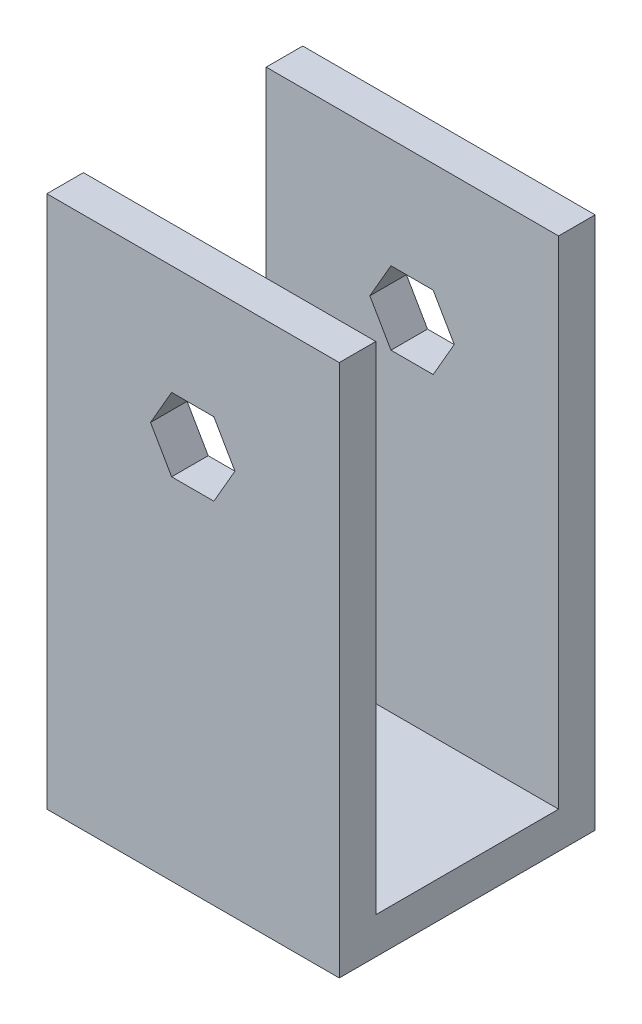
ISO-10303-21;
HEADER;
FILE_DESCRIPTION(('STEP AP214'),'2;1');
FILE_NAME('part.step','',(''),(''),'','','');
FILE_SCHEMA(('AUTOMOTIVE_DESIGN { 1 0 10303 214 1 1 1 1 }'));
ENDSEC;
DATA;
#1=APPLICATION_CONTEXT('core data for automotive mechanical design processes');
#2=APPLICATION_PROTOCOL_DEFINITION('international standard','automotive_design',2000,#1);
#3=PRODUCT_CONTEXT('',#1,'mechanical');
#4=PRODUCT('Part','Part','',(#3));
#5=PRODUCT_RELATED_PRODUCT_CATEGORY('part','',(#4));
#6=PRODUCT_DEFINITION_FORMATION('','',#4);
#7=PRODUCT_DEFINITION_CONTEXT('part definition',#1,'design');
#8=PRODUCT_DEFINITION('design','',#6,#7);
#9=PRODUCT_DEFINITION_SHAPE('','',#8);
#10=(LENGTH_UNIT() NAMED_UNIT(*) SI_UNIT(.MILLI.,.METRE.));
#11=(NAMED_UNIT(*) PLANE_ANGLE_UNIT() SI_UNIT($,.RADIAN.));
#12=(NAMED_UNIT(*) SI_UNIT($,.STERADIAN.) SOLID_ANGLE_UNIT());
#13=UNCERTAINTY_MEASURE_WITH_UNIT(LENGTH_MEASURE(1.E-05),#10,'distance_accuracy_value','');
#14=(GEOMETRIC_REPRESENTATION_CONTEXT(3) GLOBAL_UNCERTAINTY_ASSIGNED_CONTEXT((#13)) GLOBAL_UNIT_ASSIGNED_CONTEXT((#10,
#11,#12)) REPRESENTATION_CONTEXT('',''));
#15=CARTESIAN_POINT('',(0.,0.,0.));
#16=DIRECTION('',(0.,0.,1.));
#17=DIRECTION('',(1.,0.,0.));
#18=AXIS2_PLACEMENT_3D('',#15,#16,#17);
#19=CARTESIAN_POINT('',(-990.720655188937,0.,6.35));
#20=DIRECTION('',(1.,0.,0.));
#21=DIRECTION('',(0.,0.,-1.));
#22=AXIS2_PLACEMENT_3D('',#19,#20,#21);
#23=PLANE('',#22);
#24=DIRECTION('',(0.,-1.,0.));
#25=VECTOR('',#24,1.);
#26=CARTESIAN_POINT('',(-990.720655188937,0.,0.));
#27=LINE('',#26,#25);
#28=CARTESIAN_POINT('',(-990.720655188937,634.949730060437,0.));
#29=VERTEX_POINT('',#28);
#30=CARTESIAN_POINT('',(-990.720655188937,542.357532007237,0.));
#31=VERTEX_POINT('',#30);
#32=EDGE_CURVE('E160',#29,#31,#27,.T.);
#33=ORIENTED_EDGE('',*,*,#32,.T.);
#34=DIRECTION('',(0.,0.,-1.));
#35=VECTOR('',#34,1.);
#36=CARTESIAN_POINT('',(-990.720655188937,542.357532007237,38.1));
#37=LINE('',#36,#35);
#38=CARTESIAN_POINT('',(-990.720655188937,542.357532007237,44.45));
#39=VERTEX_POINT('',#38);
#40=EDGE_CURVE('E374',#39,#31,#37,.T.);
#41=ORIENTED_EDGE('',*,*,#40,.F.);
#42=DIRECTION('',(0.,-1.,0.));
#43=VECTOR('',#42,1.);
#44=CARTESIAN_POINT('',(-990.720655188937,0.,44.45));
#45=LINE('',#44,#43);
#46=CARTESIAN_POINT('',(-990.720655188937,634.949730060437,44.45));
#47=VERTEX_POINT('',#46);
#48=EDGE_CURVE('E294',#47,#39,#45,.T.);
#49=ORIENTED_EDGE('',*,*,#48,.F.);
#50=DIRECTION('',(0.,0.,-1.));
#51=VECTOR('',#50,1.);
#52=CARTESIAN_POINT('',(-990.720655188937,634.949730060437,44.45));
#53=LINE('',#52,#51);
#54=CARTESIAN_POINT('',(-990.720655188937,634.949730060437,38.1));
#55=VERTEX_POINT('',#54);
#56=EDGE_CURVE('E346',#47,#55,#53,.T.);
#57=ORIENTED_EDGE('',*,*,#56,.T.);
#58=DIRECTION('',(0.,-1.,0.));
#59=VECTOR('',#58,1.);
#60=CARTESIAN_POINT('',(-990.720655188937,0.,38.1));
#61=LINE('',#60,#59);
#62=CARTESIAN_POINT('',(-990.720655188937,548.707532007236,38.1));
#63=VERTEX_POINT('',#62);
#64=EDGE_CURVE('E338',#55,#63,#61,.T.);
#65=ORIENTED_EDGE('',*,*,#64,.T.);
#66=DIRECTION('',(0.,0.,-1.));
#67=VECTOR('',#66,1.);
#68=CARTESIAN_POINT('',(-990.720655188937,548.707532007236,38.1));
#69=LINE('',#68,#67);
#70=CARTESIAN_POINT('',(-990.720655188937,548.707532007236,6.35000000000002));
#71=VERTEX_POINT('',#70);
#72=EDGE_CURVE('E145',#63,#71,#69,.T.);
#73=ORIENTED_EDGE('',*,*,#72,.T.);
#74=DIRECTION('',(0.,-1.,0.));
#75=VECTOR('',#74,1.);
#76=CARTESIAN_POINT('',(-990.720655188937,0.,6.35));
#77=LINE('',#76,#75);
#78=CARTESIAN_POINT('',(-990.720655188937,634.949730060437,6.35));
#79=VERTEX_POINT('',#78);
#80=EDGE_CURVE('E132',#79,#71,#77,.T.);
#81=ORIENTED_EDGE('',*,*,#80,.F.);
#82=DIRECTION('',(0.,0.,-1.));
#83=VECTOR('',#82,1.);
#84=CARTESIAN_POINT('',(-990.720655188937,634.949730060437,6.35));
#85=LINE('',#84,#83);
#86=EDGE_CURVE('E45',#79,#29,#85,.T.);
#87=ORIENTED_EDGE('',*,*,#86,.T.);
#88=EDGE_LOOP('',(#33,#41,#49,#57,#65,#73,#81,#87));
#89=FACE_BOUND('',#88,.T.);
#90=ADVANCED_FACE('F35',(#89),#23,.F.);
#91=CARTESIAN_POINT('',(-939.920655188937,0.,6.35));
#92=DIRECTION('',(1.,0.,0.));
#93=DIRECTION('',(0.,0.,-1.));
#94=AXIS2_PLACEMENT_3D('',#91,#92,#93);
#95=PLANE('',#94);
#96=DIRECTION('',(0.,-1.,0.));
#97=VECTOR('',#96,1.);
#98=CARTESIAN_POINT('',(-939.920655188937,0.,0.));
#99=LINE('',#98,#97);
#100=CARTESIAN_POINT('',(-939.920655188937,634.949730060437,0.));
#101=VERTEX_POINT('',#100);
#102=CARTESIAN_POINT('',(-939.920655188937,542.357532007237,0.));
#103=VERTEX_POINT('',#102);
#104=EDGE_CURVE('E162',#101,#103,#99,.T.);
#105=ORIENTED_EDGE('',*,*,#104,.F.);
#106=DIRECTION('',(0.,0.,-1.));
#107=VECTOR('',#106,1.);
#108=CARTESIAN_POINT('',(-939.920655188937,634.949730060437,6.35));
#109=LINE('',#108,#107);
#110=CARTESIAN_POINT('',(-939.920655188937,634.949730060437,6.35));
#111=VERTEX_POINT('',#110);
#112=EDGE_CURVE('E11',#111,#101,#109,.T.);
#113=ORIENTED_EDGE('',*,*,#112,.F.);
#114=DIRECTION('',(0.,-1.,0.));
#115=VECTOR('',#114,1.);
#116=CARTESIAN_POINT('',(-939.920655188937,0.,6.35));
#117=LINE('',#116,#115);
#118=CARTESIAN_POINT('',(-939.920655188937,548.707532007236,6.35));
#119=VERTEX_POINT('',#118);
#120=EDGE_CURVE('E131',#111,#119,#117,.T.);
#121=ORIENTED_EDGE('',*,*,#120,.T.);
#122=DIRECTION('',(0.,0.,-1.));
#123=VECTOR('',#122,1.);
#124=CARTESIAN_POINT('',(-939.920655188937,548.707532007236,38.1));
#125=LINE('',#124,#123);
#126=CARTESIAN_POINT('',(-939.920655188937,548.707532007236,38.1));
#127=VERTEX_POINT('',#126);
#128=EDGE_CURVE('E112',#127,#119,#125,.T.);
#129=ORIENTED_EDGE('',*,*,#128,.F.);
#130=DIRECTION('',(0.,1.,0.));
#131=VECTOR('',#130,1.);
#132=CARTESIAN_POINT('',(-939.920655188937,0.,38.1));
#133=LINE('',#132,#131);
#134=CARTESIAN_POINT('',(-939.920655188937,634.949730060437,38.1));
#135=VERTEX_POINT('',#134);
#136=EDGE_CURVE('E341',#127,#135,#133,.T.);
#137=ORIENTED_EDGE('',*,*,#136,.T.);
#138=DIRECTION('',(0.,0.,-1.));
#139=VECTOR('',#138,1.);
#140=CARTESIAN_POINT('',(-939.920655188937,634.949730060437,44.45));
#141=LINE('',#140,#139);
#142=CARTESIAN_POINT('',(-939.920655188937,634.949730060437,44.45));
#143=VERTEX_POINT('',#142);
#144=EDGE_CURVE('E348',#143,#135,#141,.T.);
#145=ORIENTED_EDGE('',*,*,#144,.F.);
#146=DIRECTION('',(0.,1.,0.));
#147=VECTOR('',#146,1.);
#148=CARTESIAN_POINT('',(-939.920655188937,0.,44.45));
#149=LINE('',#148,#147);
#150=CARTESIAN_POINT('',(-939.920655188937,542.357532007237,44.45));
#151=VERTEX_POINT('',#150);
#152=EDGE_CURVE('E310',#151,#143,#149,.T.);
#153=ORIENTED_EDGE('',*,*,#152,.F.);
#154=DIRECTION('',(0.,0.,-1.));
#155=VECTOR('',#154,1.);
#156=CARTESIAN_POINT('',(-939.920655188937,542.357532007237,38.1));
#157=LINE('',#156,#155);
#158=EDGE_CURVE('E124',#151,#103,#157,.T.);
#159=ORIENTED_EDGE('',*,*,#158,.T.);
#160=EDGE_LOOP('',(#105,#113,#121,#129,#137,#145,#153,#159));
#161=FACE_BOUND('',#160,.T.);
#162=ADVANCED_FACE('F134',(#161),#95,.T.);
#163=CARTESIAN_POINT('',(-993.473423088237,573.582148252724,6.35));
#164=DIRECTION('',(0.866025403784442,-0.499999999999994,0.));
#165=DIRECTION('',(0.499999999999994,0.866025403784442,0.));
#166=AXIS2_PLACEMENT_3D('',#163,#164,#165);
#167=PLANE('',#166);
#168=DIRECTION('',(-0.499999999999994,-0.866025403784442,0.));
#169=VECTOR('',#168,1.);
#170=CARTESIAN_POINT('',(-993.473423088237,573.582148252724,0.));
#171=LINE('',#170,#169);
#172=CARTESIAN_POINT('',(-969.0413558401,615.899730060437,0.));
#173=VERTEX_POINT('',#172);
#174=CARTESIAN_POINT('',(-972.707530049454,609.549730060437,0.));
#175=VERTEX_POINT('',#174);
#176=EDGE_CURVE('E141',#173,#175,#171,.T.);
#177=ORIENTED_EDGE('',*,*,#176,.F.);
#178=DIRECTION('',(0.,0.,-1.));
#179=VECTOR('',#178,1.);
#180=CARTESIAN_POINT('',(-969.0413558401,615.899730060437,6.35));
#181=LINE('',#180,#179);
#182=CARTESIAN_POINT('',(-969.0413558401,615.899730060437,6.35));
#183=VERTEX_POINT('',#182);
#184=EDGE_CURVE('E39',#183,#173,#181,.T.);
#185=ORIENTED_EDGE('',*,*,#184,.F.);
#186=DIRECTION('',(-0.499999999999994,-0.866025403784442,0.));
#187=VECTOR('',#186,1.);
#188=CARTESIAN_POINT('',(-993.473423088237,573.582148252724,6.35));
#189=LINE('',#188,#187);
#190=CARTESIAN_POINT('',(-972.707530049454,609.549730060437,6.35));
#191=VERTEX_POINT('',#190);
#192=EDGE_CURVE('E168',#183,#191,#189,.T.);
#193=ORIENTED_EDGE('',*,*,#192,.T.);
#194=DIRECTION('',(0.,0.,-1.));
#195=VECTOR('',#194,1.);
#196=CARTESIAN_POINT('',(-972.707530049454,609.549730060437,6.35));
#197=LINE('',#196,#195);
#198=EDGE_CURVE('E137',#191,#175,#197,.T.);
#199=ORIENTED_EDGE('',*,*,#198,.T.);
#200=EDGE_LOOP('',(#177,#185,#193,#199));
#201=FACE_BOUND('',#200,.T.);
#202=ADVANCED_FACE('F37',(#201),#167,.T.);
#203=CARTESIAN_POINT('',(0.,615.899730060437,6.35));
#204=DIRECTION('',(0.,-1.,0.));
#205=DIRECTION('',(0.,0.,-1.));
#206=AXIS2_PLACEMENT_3D('',#203,#204,#205);
#207=PLANE('',#206);
#208=DIRECTION('',(-1.,0.,0.));
#209=VECTOR('',#208,1.);
#210=CARTESIAN_POINT('',(0.,615.899730060437,0.));
#211=LINE('',#210,#209);
#212=CARTESIAN_POINT('',(-961.709007421391,615.899730060437,0.));
#213=VERTEX_POINT('',#212);
#214=EDGE_CURVE('E144',#213,#173,#211,.T.);
#215=ORIENTED_EDGE('',*,*,#214,.F.);
#216=DIRECTION('',(0.,0.,-1.));
#217=VECTOR('',#216,1.);
#218=CARTESIAN_POINT('',(-961.709007421391,615.899730060437,6.35));
#219=LINE('',#218,#217);
#220=CARTESIAN_POINT('',(-961.709007421391,615.899730060437,6.35));
#221=VERTEX_POINT('',#220);
#222=EDGE_CURVE('E176',#221,#213,#219,.T.);
#223=ORIENTED_EDGE('',*,*,#222,.F.);
#224=DIRECTION('',(-1.,0.,0.));
#225=VECTOR('',#224,1.);
#226=CARTESIAN_POINT('',(0.,615.899730060437,6.35));
#227=LINE('',#226,#225);
#228=EDGE_CURVE('E185',#221,#183,#227,.T.);
#229=ORIENTED_EDGE('',*,*,#228,.T.);
#230=ORIENTED_EDGE('',*,*,#184,.T.);
#231=EDGE_LOOP('',(#215,#223,#229,#230));
#232=FACE_BOUND('',#231,.T.);
#233=ADVANCED_FACE('F183',(#232),#207,.T.);
#234=CARTESIAN_POINT('',(-454.58934935789,-262.457283222512,6.35));
#235=DIRECTION('',(-0.866025403784441,-0.499999999999996,0.));
#236=DIRECTION('',(0.499999999999996,-0.866025403784441,0.));
#237=AXIS2_PLACEMENT_3D('',#234,#235,#236);
#238=PLANE('',#237);
#239=DIRECTION('',(-0.499999999999996,0.866025403784441,0.));
#240=VECTOR('',#239,1.);
#241=CARTESIAN_POINT('',(-454.58934935789,-262.457283222512,0.));
#242=LINE('',#241,#240);
#243=CARTESIAN_POINT('',(-958.042833212037,609.549730060437,0.));
#244=VERTEX_POINT('',#243);
#245=EDGE_CURVE('E148',#244,#213,#242,.T.);
#246=ORIENTED_EDGE('',*,*,#245,.F.);
#247=DIRECTION('',(0.,0.,-1.));
#248=VECTOR('',#247,1.);
#249=CARTESIAN_POINT('',(-958.042833212037,609.549730060437,6.35));
#250=LINE('',#249,#248);
#251=CARTESIAN_POINT('',(-958.042833212037,609.549730060437,6.35));
#252=VERTEX_POINT('',#251);
#253=EDGE_CURVE('E175',#252,#244,#250,.T.);
#254=ORIENTED_EDGE('',*,*,#253,.F.);
#255=DIRECTION('',(-0.499999999999996,0.866025403784441,0.));
#256=VECTOR('',#255,1.);
#257=CARTESIAN_POINT('',(-454.58934935789,-262.457283222512,6.35));
#258=LINE('',#257,#256);
#259=EDGE_CURVE('E193',#252,#221,#258,.T.);
#260=ORIENTED_EDGE('',*,*,#259,.T.);
#261=ORIENTED_EDGE('',*,*,#222,.T.);
#262=EDGE_LOOP('',(#246,#254,#260,#261));
#263=FACE_BOUND('',#262,.T.);
#264=ADVANCED_FACE('F191',(#263),#238,.T.);
#265=CARTESIAN_POINT('',(-982.474900460172,567.232148252729,6.35));
#266=DIRECTION('',(-0.866025403784439,0.499999999999999,0.));
#267=DIRECTION('',(-0.499999999999999,-0.866025403784439,0.));
#268=AXIS2_PLACEMENT_3D('',#265,#266,#267);
#269=PLANE('',#268);
#270=DIRECTION('',(0.499999999999999,0.866025403784439,0.));
#271=VECTOR('',#270,1.);
#272=CARTESIAN_POINT('',(-982.474900460172,567.232148252729,0.));
#273=LINE('',#272,#271);
#274=CARTESIAN_POINT('',(-961.709007421391,603.199730060437,0.));
#275=VERTEX_POINT('',#274);
#276=EDGE_CURVE('E151',#275,#244,#273,.T.);
#277=ORIENTED_EDGE('',*,*,#276,.F.);
#278=DIRECTION('',(0.,0.,-1.));
#279=VECTOR('',#278,1.);
#280=CARTESIAN_POINT('',(-961.709007421391,603.199730060437,6.35));
#281=LINE('',#280,#279);
#282=CARTESIAN_POINT('',(-961.709007421391,603.199730060437,6.35));
#283=VERTEX_POINT('',#282);
#284=EDGE_CURVE('E173',#283,#275,#281,.T.);
#285=ORIENTED_EDGE('',*,*,#284,.F.);
#286=DIRECTION('',(0.499999999999999,0.866025403784439,0.));
#287=VECTOR('',#286,1.);
#288=CARTESIAN_POINT('',(-982.474900460172,567.232148252729,6.35));
#289=LINE('',#288,#287);
#290=EDGE_CURVE('E199',#283,#252,#289,.T.);
#291=ORIENTED_EDGE('',*,*,#290,.T.);
#292=ORIENTED_EDGE('',*,*,#253,.T.);
#293=EDGE_LOOP('',(#277,#285,#291,#292));
#294=FACE_BOUND('',#293,.T.);
#295=ADVANCED_FACE('F202',(#294),#269,.T.);
#296=CARTESIAN_POINT('',(0.,603.199730060437,6.35));
#297=DIRECTION('',(0.,1.,0.));
#298=DIRECTION('',(0.,0.,1.));
#299=AXIS2_PLACEMENT_3D('',#296,#297,#298);
#300=PLANE('',#299);
#301=DIRECTION('',(1.,0.,0.));
#302=VECTOR('',#301,1.);
#303=CARTESIAN_POINT('',(0.,603.199730060437,0.));
#304=LINE('',#303,#302);
#305=CARTESIAN_POINT('',(-969.0413558401,603.199730060437,0.));
#306=VERTEX_POINT('',#305);
#307=EDGE_CURVE('E154',#306,#275,#304,.T.);
#308=ORIENTED_EDGE('',*,*,#307,.F.);
#309=DIRECTION('',(0.,0.,-1.));
#310=VECTOR('',#309,1.);
#311=CARTESIAN_POINT('',(-969.0413558401,603.199730060437,6.35));
#312=LINE('',#311,#310);
#313=CARTESIAN_POINT('',(-969.0413558401,603.199730060437,6.35));
#314=VERTEX_POINT('',#313);
#315=EDGE_CURVE('E171',#314,#306,#312,.T.);
#316=ORIENTED_EDGE('',*,*,#315,.F.);
#317=DIRECTION('',(1.,0.,0.));
#318=VECTOR('',#317,1.);
#319=CARTESIAN_POINT('',(0.,603.199730060437,6.35));
#320=LINE('',#319,#318);
#321=EDGE_CURVE('E203',#314,#283,#320,.T.);
#322=ORIENTED_EDGE('',*,*,#321,.T.);
#323=ORIENTED_EDGE('',*,*,#284,.T.);
#324=EDGE_LOOP('',(#308,#316,#322,#323));
#325=FACE_BOUND('',#324,.T.);
#326=ADVANCED_FACE('F215',(#325),#300,.T.);
#327=CARTESIAN_POINT('',(-465.587871985946,-268.807283222512,6.35));
#328=DIRECTION('',(0.866025403784438,0.500000000000001,0.));
#329=DIRECTION('',(-0.500000000000001,0.866025403784438,0.));
#330=AXIS2_PLACEMENT_3D('',#327,#328,#329);
#331=PLANE('',#330);
#332=DIRECTION('',(0.500000000000001,-0.866025403784438,0.));
#333=VECTOR('',#332,1.);
#334=CARTESIAN_POINT('',(-465.587871985946,-268.807283222512,0.));
#335=LINE('',#334,#333);
#336=EDGE_CURVE('E157',#175,#306,#335,.T.);
#337=ORIENTED_EDGE('',*,*,#336,.F.);
#338=ORIENTED_EDGE('',*,*,#198,.F.);
#339=DIRECTION('',(0.500000000000001,-0.866025403784438,0.));
#340=VECTOR('',#339,1.);
#341=CARTESIAN_POINT('',(-465.587871985946,-268.807283222512,6.35));
#342=LINE('',#341,#340);
#343=EDGE_CURVE('E205',#191,#314,#342,.T.);
#344=ORIENTED_EDGE('',*,*,#343,.T.);
#345=ORIENTED_EDGE('',*,*,#315,.T.);
#346=EDGE_LOOP('',(#337,#338,#344,#345));
#347=FACE_BOUND('',#346,.T.);
#348=ADVANCED_FACE('F212',(#347),#331,.T.);
#349=CARTESIAN_POINT('',(0.,634.949730060437,6.35));
#350=DIRECTION('',(0.,1.,0.));
#351=DIRECTION('',(0.,0.,1.));
#352=AXIS2_PLACEMENT_3D('',#349,#350,#351);
#353=PLANE('',#352);
#354=DIRECTION('',(1.,0.,0.));
#355=VECTOR('',#354,1.);
#356=CARTESIAN_POINT('',(0.,634.949730060437,0.));
#357=LINE('',#356,#355);
#358=EDGE_CURVE('E165',#29,#101,#357,.T.);
#359=ORIENTED_EDGE('',*,*,#358,.F.);
#360=ORIENTED_EDGE('',*,*,#86,.F.);
#361=DIRECTION('',(1.,0.,0.));
#362=VECTOR('',#361,1.);
#363=CARTESIAN_POINT('',(0.,634.949730060437,6.35));
#364=LINE('',#363,#362);
#365=EDGE_CURVE('E135',#79,#111,#364,.T.);
#366=ORIENTED_EDGE('',*,*,#365,.T.);
#367=ORIENTED_EDGE('',*,*,#112,.T.);
#368=EDGE_LOOP('',(#359,#360,#366,#367));
#369=FACE_BOUND('',#368,.T.);
#370=ADVANCED_FACE('F222',(#369),#353,.T.);
#371=CARTESIAN_POINT('',(0.,0.,6.35));
#372=DIRECTION('',(0.,0.,1.));
#373=DIRECTION('',(1.,0.,0.));
#374=AXIS2_PLACEMENT_3D('',#371,#372,#373);
#375=PLANE('',#374);
#376=ORIENTED_EDGE('',*,*,#192,.F.);
#377=ORIENTED_EDGE('',*,*,#228,.F.);
#378=ORIENTED_EDGE('',*,*,#259,.F.);
#379=ORIENTED_EDGE('',*,*,#290,.F.);
#380=ORIENTED_EDGE('',*,*,#321,.F.);
#381=ORIENTED_EDGE('',*,*,#343,.F.);
#382=EDGE_LOOP('',(#376,#377,#378,#379,#380,#381));
#383=FACE_BOUND('',#382,.T.);
#384=ORIENTED_EDGE('',*,*,#80,.T.);
#385=DIRECTION('',(1.,0.,0.));
#386=VECTOR('',#385,1.);
#387=CARTESIAN_POINT('',(0.,548.707532007236,6.35));
#388=LINE('',#387,#386);
#389=EDGE_CURVE('E116',#71,#119,#388,.T.);
#390=ORIENTED_EDGE('',*,*,#389,.T.);
#391=ORIENTED_EDGE('',*,*,#120,.F.);
#392=ORIENTED_EDGE('',*,*,#365,.F.);
#393=EDGE_LOOP('',(#384,#390,#391,#392));
#394=FACE_BOUND('',#393,.T.);
#395=ADVANCED_FACE('F129',(#383,#394),#375,.T.);
#396=CARTESIAN_POINT('',(0.,0.,0.));
#397=DIRECTION('',(0.,0.,1.));
#398=DIRECTION('',(1.,0.,0.));
#399=AXIS2_PLACEMENT_3D('',#396,#397,#398);
#400=PLANE('',#399);
#401=ORIENTED_EDGE('',*,*,#176,.T.);
#402=ORIENTED_EDGE('',*,*,#336,.T.);
#403=ORIENTED_EDGE('',*,*,#307,.T.);
#404=ORIENTED_EDGE('',*,*,#276,.T.);
#405=ORIENTED_EDGE('',*,*,#245,.T.);
#406=ORIENTED_EDGE('',*,*,#214,.T.);
#407=EDGE_LOOP('',(#401,#402,#403,#404,#405,#406));
#408=FACE_BOUND('',#407,.T.);
#409=ORIENTED_EDGE('',*,*,#32,.F.);
#410=ORIENTED_EDGE('',*,*,#358,.T.);
#411=ORIENTED_EDGE('',*,*,#104,.T.);
#412=DIRECTION('',(1.,0.,0.));
#413=VECTOR('',#412,1.);
#414=CARTESIAN_POINT('',(0.,542.357532007237,0.));
#415=LINE('',#414,#413);
#416=EDGE_CURVE('E352',#31,#103,#415,.T.);
#417=ORIENTED_EDGE('',*,*,#416,.F.);
#418=EDGE_LOOP('',(#409,#410,#411,#417));
#419=FACE_BOUND('',#418,.T.);
#420=ADVANCED_FACE('F188',(#408,#419),#400,.F.);
#421=CARTESIAN_POINT('',(0.,548.707532007236,38.1));
#422=DIRECTION('',(0.,1.,0.));
#423=DIRECTION('',(0.,0.,1.));
#424=AXIS2_PLACEMENT_3D('',#421,#422,#423);
#425=PLANE('',#424);
#426=ORIENTED_EDGE('',*,*,#389,.F.);
#427=ORIENTED_EDGE('',*,*,#72,.F.);
#428=DIRECTION('',(1.,0.,0.));
#429=VECTOR('',#428,1.);
#430=CARTESIAN_POINT('',(0.,548.707532007236,38.1));
#431=LINE('',#430,#429);
#432=EDGE_CURVE('E120',#63,#127,#431,.T.);
#433=ORIENTED_EDGE('',*,*,#432,.T.);
#434=ORIENTED_EDGE('',*,*,#128,.T.);
#435=EDGE_LOOP('',(#426,#427,#433,#434));
#436=FACE_BOUND('',#435,.T.);
#437=ADVANCED_FACE('F114',(#436),#425,.T.);
#438=CARTESIAN_POINT('',(0.,542.357532007237,38.1));
#439=DIRECTION('',(0.,1.,0.));
#440=DIRECTION('',(0.,0.,1.));
#441=AXIS2_PLACEMENT_3D('',#438,#439,#440);
#442=PLANE('',#441);
#443=ORIENTED_EDGE('',*,*,#416,.T.);
#444=ORIENTED_EDGE('',*,*,#158,.F.);
#445=DIRECTION('',(1.,0.,0.));
#446=VECTOR('',#445,1.);
#447=CARTESIAN_POINT('',(0.,542.357532007237,44.45));
#448=LINE('',#447,#446);
#449=EDGE_CURVE('E298',#39,#151,#448,.T.);
#450=ORIENTED_EDGE('',*,*,#449,.F.);
#451=ORIENTED_EDGE('',*,*,#40,.T.);
#452=EDGE_LOOP('',(#443,#444,#450,#451));
#453=FACE_BOUND('',#452,.T.);
#454=ADVANCED_FACE('F240',(#453),#442,.F.);
#455=CARTESIAN_POINT('',(-454.589349357911,-262.457283222513,44.45));
#456=DIRECTION('',(-0.86602540378445,-0.49999999999998,0.));
#457=DIRECTION('',(0.49999999999998,-0.86602540378445,0.));
#458=AXIS2_PLACEMENT_3D('',#455,#456,#457);
#459=PLANE('',#458);
#460=DIRECTION('',(-0.49999999999998,0.86602540378445,0.));
#461=VECTOR('',#460,1.);
#462=CARTESIAN_POINT('',(-454.589349357911,-262.457283222513,38.1));
#463=LINE('',#462,#461);
#464=CARTESIAN_POINT('',(-958.042833212037,609.549730060437,38.1));
#465=VERTEX_POINT('',#464);
#466=CARTESIAN_POINT('',(-961.709007421391,615.899730060437,38.1));
#467=VERTEX_POINT('',#466);
#468=EDGE_CURVE('E320',#465,#467,#463,.T.);
#469=ORIENTED_EDGE('',*,*,#468,.F.);
#470=DIRECTION('',(0.,0.,-1.));
#471=VECTOR('',#470,1.);
#472=CARTESIAN_POINT('',(-958.042833212037,609.549730060437,44.45));
#473=LINE('',#472,#471);
#474=CARTESIAN_POINT('',(-958.042833212037,609.549730060437,44.45));
#475=VERTEX_POINT('',#474);
#476=EDGE_CURVE('E349',#475,#465,#473,.T.);
#477=ORIENTED_EDGE('',*,*,#476,.F.);
#478=DIRECTION('',(-0.49999999999998,0.86602540378445,0.));
#479=VECTOR('',#478,1.);
#480=CARTESIAN_POINT('',(-454.589349357911,-262.457283222513,44.45));
#481=LINE('',#480,#479);
#482=CARTESIAN_POINT('',(-961.709007421391,615.899730060437,44.45));
#483=VERTEX_POINT('',#482);
#484=EDGE_CURVE('E287',#475,#483,#481,.T.);
#485=ORIENTED_EDGE('',*,*,#484,.T.);
#486=DIRECTION('',(0.,0.,-1.));
#487=VECTOR('',#486,1.);
#488=CARTESIAN_POINT('',(-961.709007421391,615.899730060437,44.45));
#489=LINE('',#488,#487);
#490=EDGE_CURVE('E319',#483,#467,#489,.T.);
#491=ORIENTED_EDGE('',*,*,#490,.T.);
#492=EDGE_LOOP('',(#469,#477,#485,#491));
#493=FACE_BOUND('',#492,.T.);
#494=ADVANCED_FACE('F243',(#493),#459,.T.);
#495=CARTESIAN_POINT('',(-982.474900460178,567.232148252716,44.45));
#496=DIRECTION('',(-0.866025403784446,0.499999999999988,0.));
#497=DIRECTION('',(-0.499999999999988,-0.866025403784446,0.));
#498=AXIS2_PLACEMENT_3D('',#495,#496,#497);
#499=PLANE('',#498);
#500=DIRECTION('',(0.499999999999988,0.866025403784446,0.));
#501=VECTOR('',#500,1.);
#502=CARTESIAN_POINT('',(-982.474900460178,567.232148252716,38.1));
#503=LINE('',#502,#501);
#504=CARTESIAN_POINT('',(-961.709007421391,603.199730060437,38.1));
#505=VERTEX_POINT('',#504);
#506=EDGE_CURVE('E323',#505,#465,#503,.T.);
#507=ORIENTED_EDGE('',*,*,#506,.F.);
#508=DIRECTION('',(0.,0.,-1.));
#509=VECTOR('',#508,1.);
#510=CARTESIAN_POINT('',(-961.709007421391,603.199730060437,44.45));
#511=LINE('',#510,#509);
#512=CARTESIAN_POINT('',(-961.709007421391,603.199730060437,44.45));
#513=VERTEX_POINT('',#512);
#514=EDGE_CURVE('E364',#513,#505,#511,.T.);
#515=ORIENTED_EDGE('',*,*,#514,.F.);
#516=DIRECTION('',(0.499999999999988,0.866025403784446,0.));
#517=VECTOR('',#516,1.);
#518=CARTESIAN_POINT('',(-982.474900460178,567.232148252716,44.45));
#519=LINE('',#518,#517);
#520=EDGE_CURVE('E428',#513,#475,#519,.T.);
#521=ORIENTED_EDGE('',*,*,#520,.T.);
#522=ORIENTED_EDGE('',*,*,#476,.T.);
#523=EDGE_LOOP('',(#507,#515,#521,#522));
#524=FACE_BOUND('',#523,.T.);
#525=ADVANCED_FACE('F247',(#524),#499,.T.);
#526=CARTESIAN_POINT('',(0.,603.199730060437,44.45));
#527=DIRECTION('',(0.,1.,0.));
#528=DIRECTION('',(0.,0.,1.));
#529=AXIS2_PLACEMENT_3D('',#526,#527,#528);
#530=PLANE('',#529);
#531=DIRECTION('',(1.,0.,0.));
#532=VECTOR('',#531,1.);
#533=CARTESIAN_POINT('',(0.,603.199730060437,38.1));
#534=LINE('',#533,#532);
#535=CARTESIAN_POINT('',(-969.0413558401,603.199730060437,38.1));
#536=VERTEX_POINT('',#535);
#537=EDGE_CURVE('E326',#536,#505,#534,.T.);
#538=ORIENTED_EDGE('',*,*,#537,.F.);
#539=DIRECTION('',(0.,0.,-1.));
#540=VECTOR('',#539,1.);
#541=CARTESIAN_POINT('',(-969.0413558401,603.199730060437,44.45));
#542=LINE('',#541,#540);
#543=CARTESIAN_POINT('',(-969.0413558401,603.199730060437,44.45));
#544=VERTEX_POINT('',#543);
#545=EDGE_CURVE('E361',#544,#536,#542,.T.);
#546=ORIENTED_EDGE('',*,*,#545,.F.);
#547=DIRECTION('',(1.,0.,0.));
#548=VECTOR('',#547,1.);
#549=CARTESIAN_POINT('',(0.,603.199730060437,44.45));
#550=LINE('',#549,#548);
#551=EDGE_CURVE('E436',#544,#513,#550,.T.);
#552=ORIENTED_EDGE('',*,*,#551,.T.);
#553=ORIENTED_EDGE('',*,*,#514,.T.);
#554=EDGE_LOOP('',(#538,#546,#552,#553));
#555=FACE_BOUND('',#554,.T.);
#556=ADVANCED_FACE('F251',(#555),#530,.T.);
#557=CARTESIAN_POINT('',(-465.587871985946,-268.807283222512,44.45));
#558=DIRECTION('',(0.866025403784438,0.500000000000001,0.));
#559=DIRECTION('',(-0.500000000000001,0.866025403784438,0.));
#560=AXIS2_PLACEMENT_3D('',#557,#558,#559);
#561=PLANE('',#560);
#562=DIRECTION('',(0.500000000000001,-0.866025403784438,0.));
#563=VECTOR('',#562,1.);
#564=CARTESIAN_POINT('',(-465.587871985946,-268.807283222512,38.1));
#565=LINE('',#564,#563);
#566=CARTESIAN_POINT('',(-972.707530049454,609.549730060437,38.1));
#567=VERTEX_POINT('',#566);
#568=EDGE_CURVE('E329',#567,#536,#565,.T.);
#569=ORIENTED_EDGE('',*,*,#568,.F.);
#570=DIRECTION('',(0.,0.,-1.));
#571=VECTOR('',#570,1.);
#572=CARTESIAN_POINT('',(-972.707530049454,609.549730060437,44.45));
#573=LINE('',#572,#571);
#574=CARTESIAN_POINT('',(-972.707530049454,609.549730060437,44.45));
#575=VERTEX_POINT('',#574);
#576=EDGE_CURVE('E358',#575,#567,#573,.T.);
#577=ORIENTED_EDGE('',*,*,#576,.F.);
#578=DIRECTION('',(0.500000000000001,-0.866025403784438,0.));
#579=VECTOR('',#578,1.);
#580=CARTESIAN_POINT('',(-465.587871985946,-268.807283222512,44.45));
#581=LINE('',#580,#579);
#582=EDGE_CURVE('E435',#575,#544,#581,.T.);
#583=ORIENTED_EDGE('',*,*,#582,.T.);
#584=ORIENTED_EDGE('',*,*,#545,.T.);
#585=EDGE_LOOP('',(#569,#577,#583,#584));
#586=FACE_BOUND('',#585,.T.);
#587=ADVANCED_FACE('F255',(#586),#561,.T.);
#588=CARTESIAN_POINT('',(-993.473423088237,573.582148252724,44.45));
#589=DIRECTION('',(0.866025403784442,-0.499999999999994,0.));
#590=DIRECTION('',(0.499999999999994,0.866025403784442,0.));
#591=AXIS2_PLACEMENT_3D('',#588,#589,#590);
#592=PLANE('',#591);
#593=DIRECTION('',(-0.499999999999994,-0.866025403784442,0.));
#594=VECTOR('',#593,1.);
#595=CARTESIAN_POINT('',(-993.473423088237,573.582148252724,38.1));
#596=LINE('',#595,#594);
#597=CARTESIAN_POINT('',(-969.0413558401,615.899730060437,38.1));
#598=VERTEX_POINT('',#597);
#599=EDGE_CURVE('E332',#598,#567,#596,.T.);
#600=ORIENTED_EDGE('',*,*,#599,.F.);
#601=DIRECTION('',(0.,0.,-1.));
#602=VECTOR('',#601,1.);
#603=CARTESIAN_POINT('',(-969.0413558401,615.899730060437,44.45));
#604=LINE('',#603,#602);
#605=CARTESIAN_POINT('',(-969.0413558401,615.899730060437,44.45));
#606=VERTEX_POINT('',#605);
#607=EDGE_CURVE('E355',#606,#598,#604,.T.);
#608=ORIENTED_EDGE('',*,*,#607,.F.);
#609=DIRECTION('',(-0.499999999999994,-0.866025403784442,0.));
#610=VECTOR('',#609,1.);
#611=CARTESIAN_POINT('',(-993.473423088237,573.582148252724,44.45));
#612=LINE('',#611,#610);
#613=EDGE_CURVE('E313',#606,#575,#612,.T.);
#614=ORIENTED_EDGE('',*,*,#613,.T.);
#615=ORIENTED_EDGE('',*,*,#576,.T.);
#616=EDGE_LOOP('',(#600,#608,#614,#615));
#617=FACE_BOUND('',#616,.T.);
#618=ADVANCED_FACE('F259',(#617),#592,.T.);
#619=CARTESIAN_POINT('',(9.32560786976262E-12,615.899730060423,44.45));
#620=DIRECTION('',(0.,-1.,0.));
#621=DIRECTION('',(1.,0.,0.));
#622=AXIS2_PLACEMENT_3D('',#619,#620,#621);
#623=PLANE('',#622);
#624=DIRECTION('',(-1.,0.,0.));
#625=VECTOR('',#624,1.);
#626=CARTESIAN_POINT('',(9.32560786976262E-12,615.899730060423,38.1));
#627=LINE('',#626,#625);
#628=EDGE_CURVE('E335',#467,#598,#627,.T.);
#629=ORIENTED_EDGE('',*,*,#628,.F.);
#630=ORIENTED_EDGE('',*,*,#490,.F.);
#631=DIRECTION('',(-1.,0.,0.));
#632=VECTOR('',#631,1.);
#633=CARTESIAN_POINT('',(9.32560786976262E-12,615.899730060423,44.45));
#634=LINE('',#633,#632);
#635=EDGE_CURVE('E308',#483,#606,#634,.T.);
#636=ORIENTED_EDGE('',*,*,#635,.T.);
#637=ORIENTED_EDGE('',*,*,#607,.T.);
#638=EDGE_LOOP('',(#629,#630,#636,#637));
#639=FACE_BOUND('',#638,.T.);
#640=ADVANCED_FACE('F263',(#639),#623,.T.);
#641=CARTESIAN_POINT('',(0.,634.949730060437,44.45));
#642=DIRECTION('',(0.,-1.,0.));
#643=DIRECTION('',(0.,0.,-1.));
#644=AXIS2_PLACEMENT_3D('',#641,#642,#643);
#645=PLANE('',#644);
#646=DIRECTION('',(-1.,0.,0.));
#647=VECTOR('',#646,1.);
#648=CARTESIAN_POINT('',(0.,634.949730060437,38.1));
#649=LINE('',#648,#647);
#650=EDGE_CURVE('E343',#135,#55,#649,.T.);
#651=ORIENTED_EDGE('',*,*,#650,.T.);
#652=ORIENTED_EDGE('',*,*,#56,.F.);
#653=DIRECTION('',(-1.,0.,0.));
#654=VECTOR('',#653,1.);
#655=CARTESIAN_POINT('',(0.,634.949730060437,44.45));
#656=LINE('',#655,#654);
#657=EDGE_CURVE('E302',#143,#47,#656,.T.);
#658=ORIENTED_EDGE('',*,*,#657,.F.);
#659=ORIENTED_EDGE('',*,*,#144,.T.);
#660=EDGE_LOOP('',(#651,#652,#658,#659));
#661=FACE_BOUND('',#660,.T.);
#662=ADVANCED_FACE('F267',(#661),#645,.F.);
#663=CARTESIAN_POINT('',(0.,0.,44.45));
#664=DIRECTION('',(0.,0.,1.));
#665=DIRECTION('',(1.,0.,0.));
#666=AXIS2_PLACEMENT_3D('',#663,#664,#665);
#667=PLANE('',#666);
#668=ORIENTED_EDGE('',*,*,#484,.F.);
#669=ORIENTED_EDGE('',*,*,#520,.F.);
#670=ORIENTED_EDGE('',*,*,#551,.F.);
#671=ORIENTED_EDGE('',*,*,#582,.F.);
#672=ORIENTED_EDGE('',*,*,#613,.F.);
#673=ORIENTED_EDGE('',*,*,#635,.F.);
#674=EDGE_LOOP('',(#668,#669,#670,#671,#672,#673));
#675=FACE_BOUND('',#674,.T.);
#676=ORIENTED_EDGE('',*,*,#48,.T.);
#677=ORIENTED_EDGE('',*,*,#449,.T.);
#678=ORIENTED_EDGE('',*,*,#152,.T.);
#679=ORIENTED_EDGE('',*,*,#657,.T.);
#680=EDGE_LOOP('',(#676,#677,#678,#679));
#681=FACE_BOUND('',#680,.T.);
#682=ADVANCED_FACE('F271',(#675,#681),#667,.T.);
#683=CARTESIAN_POINT('',(0.,0.,38.1));
#684=DIRECTION('',(0.,0.,1.));
#685=DIRECTION('',(1.,0.,0.));
#686=AXIS2_PLACEMENT_3D('',#683,#684,#685);
#687=PLANE('',#686);
#688=ORIENTED_EDGE('',*,*,#432,.F.);
#689=ORIENTED_EDGE('',*,*,#64,.F.);
#690=ORIENTED_EDGE('',*,*,#650,.F.);
#691=ORIENTED_EDGE('',*,*,#136,.F.);
#692=EDGE_LOOP('',(#688,#689,#690,#691));
#693=FACE_BOUND('',#692,.T.);
#694=ORIENTED_EDGE('',*,*,#468,.T.);
#695=ORIENTED_EDGE('',*,*,#628,.T.);
#696=ORIENTED_EDGE('',*,*,#599,.T.);
#697=ORIENTED_EDGE('',*,*,#568,.T.);
#698=ORIENTED_EDGE('',*,*,#537,.T.);
#699=ORIENTED_EDGE('',*,*,#506,.T.);
#700=EDGE_LOOP('',(#694,#695,#696,#697,#698,#699));
#701=FACE_BOUND('',#700,.T.);
#702=ADVANCED_FACE('F273',(#693,#701),#687,.F.);
#703=CLOSED_SHELL('',(#90,#162,#202,#233,#264,#295,#326,#348,#370,#395,#420,#437,#454,#494,#525,
#556,#587,#618,#640,#662,#682,#702));
#704=MANIFOLD_SOLID_BREP('B2',#703);
#705=ADVANCED_BREP_SHAPE_REPRESENTATION('',(#18,#704),#14);
#706=SHAPE_DEFINITION_REPRESENTATION(#9,#705);
ENDSEC;
END-ISO-10303-21;
